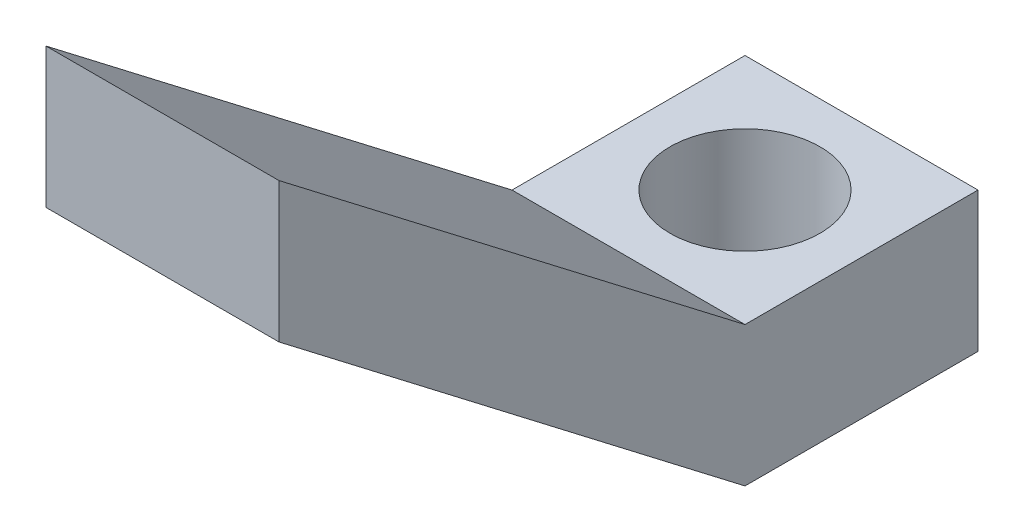
ISO-10303-21;
HEADER;
FILE_DESCRIPTION(('STEP AP214'),'2;1');
FILE_NAME('part.step','',(''),(''),'','','');
FILE_SCHEMA(('AUTOMOTIVE_DESIGN { 1 0 10303 214 1 1 1 1 }'));
ENDSEC;
DATA;
#1=APPLICATION_CONTEXT('core data for automotive mechanical design processes');
#2=APPLICATION_PROTOCOL_DEFINITION('international standard','automotive_design',2000,#1);
#3=PRODUCT_CONTEXT('',#1,'mechanical');
#4=PRODUCT('Part','Part','',(#3));
#5=PRODUCT_RELATED_PRODUCT_CATEGORY('part','',(#4));
#6=PRODUCT_DEFINITION_FORMATION('','',#4);
#7=PRODUCT_DEFINITION_CONTEXT('part definition',#1,'design');
#8=PRODUCT_DEFINITION('design','',#6,#7);
#9=PRODUCT_DEFINITION_SHAPE('','',#8);
#10=(LENGTH_UNIT() NAMED_UNIT(*) SI_UNIT(.MILLI.,.METRE.));
#11=(NAMED_UNIT(*) PLANE_ANGLE_UNIT() SI_UNIT($,.RADIAN.));
#12=(NAMED_UNIT(*) SI_UNIT($,.STERADIAN.) SOLID_ANGLE_UNIT());
#13=UNCERTAINTY_MEASURE_WITH_UNIT(LENGTH_MEASURE(1.E-05),#10,'distance_accuracy_value','');
#14=(GEOMETRIC_REPRESENTATION_CONTEXT(3) GLOBAL_UNCERTAINTY_ASSIGNED_CONTEXT((#13)) GLOBAL_UNIT_ASSIGNED_CONTEXT((#10,
#11,#12)) REPRESENTATION_CONTEXT('',''));
#15=CARTESIAN_POINT('',(0.,0.,0.));
#16=DIRECTION('',(0.,0.,1.));
#17=DIRECTION('',(1.,0.,0.));
#18=AXIS2_PLACEMENT_3D('',#15,#16,#17);
#19=CARTESIAN_POINT('',(12.5,15.,12.5));
#20=DIRECTION('',(-1.,0.,0.));
#21=DIRECTION('',(0.,0.,1.));
#22=AXIS2_PLACEMENT_3D('',#19,#20,#21);
#23=PLANE('',#22);
#24=DIRECTION('',(0.,0.,-1.));
#25=VECTOR('',#24,1.);
#26=CARTESIAN_POINT('',(12.5,0.,12.5));
#27=LINE('',#26,#25);
#28=CARTESIAN_POINT('',(12.5,0.,12.5));
#29=VERTEX_POINT('',#28);
#30=CARTESIAN_POINT('',(12.5,0.,-12.5));
#31=VERTEX_POINT('',#30);
#32=EDGE_CURVE('E82',#29,#31,#27,.T.);
#33=ORIENTED_EDGE('',*,*,#32,.T.);
#34=DIRECTION('',(0.,-1.,0.));
#35=VECTOR('',#34,1.);
#36=CARTESIAN_POINT('',(12.5,15.,-12.5));
#37=LINE('',#36,#35);
#38=CARTESIAN_POINT('',(12.5,15.,-12.5));
#39=VERTEX_POINT('',#38);
#40=EDGE_CURVE('E11',#39,#31,#37,.T.);
#41=ORIENTED_EDGE('',*,*,#40,.F.);
#42=DIRECTION('',(0.,0.,-1.));
#43=VECTOR('',#42,1.);
#44=CARTESIAN_POINT('',(12.5,15.,12.5));
#45=LINE('',#44,#43);
#46=CARTESIAN_POINT('',(12.5,15.,12.5));
#47=VERTEX_POINT('',#46);
#48=EDGE_CURVE('E151',#47,#39,#45,.T.);
#49=ORIENTED_EDGE('',*,*,#48,.F.);
#50=DIRECTION('',(0.,-0.608891231603307,-0.793253722384338));
#51=VECTOR('',#50,1.);
#52=CARTESIAN_POINT('',(12.5,15.,12.5));
#53=LINE('',#52,#51);
#54=CARTESIAN_POINT('',(12.5,53.3793491553446,62.5));
#55=VERTEX_POINT('',#54);
#56=EDGE_CURVE('E117',#55,#47,#53,.T.);
#57=ORIENTED_EDGE('',*,*,#56,.F.);
#58=DIRECTION('',(0.,1.,0.));
#59=VECTOR('',#58,1.);
#60=CARTESIAN_POINT('',(12.5,38.3793491553446,62.5));
#61=LINE('',#60,#59);
#62=CARTESIAN_POINT('',(12.5,38.3793491553446,62.5));
#63=VERTEX_POINT('',#62);
#64=EDGE_CURVE('E107',#63,#55,#61,.T.);
#65=ORIENTED_EDGE('',*,*,#64,.F.);
#66=DIRECTION('',(0.,0.608891231603307,0.793253722384338));
#67=VECTOR('',#66,1.);
#68=CARTESIAN_POINT('',(12.5,0.,12.5));
#69=LINE('',#68,#67);
#70=EDGE_CURVE('E121',#29,#63,#69,.T.);
#71=ORIENTED_EDGE('',*,*,#70,.F.);
#72=EDGE_LOOP('',(#33,#41,#49,#57,#65,#71));
#73=FACE_BOUND('',#72,.T.);
#74=ADVANCED_FACE('F45',(#73),#23,.F.);
#75=CARTESIAN_POINT('',(-12.5,15.,-12.5));
#76=DIRECTION('',(0.,0.,1.));
#77=DIRECTION('',(1.,0.,0.));
#78=AXIS2_PLACEMENT_3D('',#75,#76,#77);
#79=PLANE('',#78);
#80=DIRECTION('',(-1.,0.,0.));
#81=VECTOR('',#80,1.);
#82=CARTESIAN_POINT('',(-12.5,0.,-12.5));
#83=LINE('',#82,#81);
#84=CARTESIAN_POINT('',(-12.5,0.,-12.5));
#85=VERTEX_POINT('',#84);
#86=EDGE_CURVE('E75',#31,#85,#83,.T.);
#87=ORIENTED_EDGE('',*,*,#86,.T.);
#88=DIRECTION('',(0.,-1.,0.));
#89=VECTOR('',#88,1.);
#90=CARTESIAN_POINT('',(-12.5,15.,-12.5));
#91=LINE('',#90,#89);
#92=CARTESIAN_POINT('',(-12.5,15.,-12.5));
#93=VERTEX_POINT('',#92);
#94=EDGE_CURVE('E54',#93,#85,#91,.T.);
#95=ORIENTED_EDGE('',*,*,#94,.F.);
#96=DIRECTION('',(-1.,0.,0.));
#97=VECTOR('',#96,1.);
#98=CARTESIAN_POINT('',(-12.5,15.,-12.5));
#99=LINE('',#98,#97);
#100=EDGE_CURVE('E87',#39,#93,#99,.T.);
#101=ORIENTED_EDGE('',*,*,#100,.F.);
#102=ORIENTED_EDGE('',*,*,#40,.T.);
#103=EDGE_LOOP('',(#87,#95,#101,#102));
#104=FACE_BOUND('',#103,.T.);
#105=ADVANCED_FACE('F177',(#104),#79,.F.);
#106=CARTESIAN_POINT('',(-12.5,15.,12.5));
#107=DIRECTION('',(1.,0.,0.));
#108=DIRECTION('',(0.,0.,-1.));
#109=AXIS2_PLACEMENT_3D('',#106,#107,#108);
#110=PLANE('',#109);
#111=DIRECTION('',(0.,0.,1.));
#112=VECTOR('',#111,1.);
#113=CARTESIAN_POINT('',(-12.5,0.,12.5));
#114=LINE('',#113,#112);
#115=CARTESIAN_POINT('',(-12.5,0.,12.5));
#116=VERTEX_POINT('',#115);
#117=EDGE_CURVE('E165',#85,#116,#114,.T.);
#118=ORIENTED_EDGE('',*,*,#117,.T.);
#119=DIRECTION('',(0.,0.608891231603307,0.793253722384338));
#120=VECTOR('',#119,1.);
#121=CARTESIAN_POINT('',(-12.5,0.,12.5));
#122=LINE('',#121,#120);
#123=CARTESIAN_POINT('',(-12.5,38.3793491553446,62.5));
#124=VERTEX_POINT('',#123);
#125=EDGE_CURVE('E136',#116,#124,#122,.T.);
#126=ORIENTED_EDGE('',*,*,#125,.T.);
#127=DIRECTION('',(0.,1.,0.));
#128=VECTOR('',#127,1.);
#129=CARTESIAN_POINT('',(-12.5,38.3793491553446,62.5));
#130=LINE('',#129,#128);
#131=CARTESIAN_POINT('',(-12.5,53.3793491553446,62.5));
#132=VERTEX_POINT('',#131);
#133=EDGE_CURVE('E110',#124,#132,#130,.T.);
#134=ORIENTED_EDGE('',*,*,#133,.T.);
#135=DIRECTION('',(0.,-0.608891231603307,-0.793253722384338));
#136=VECTOR('',#135,1.);
#137=CARTESIAN_POINT('',(-12.5,15.,12.5));
#138=LINE('',#137,#136);
#139=CARTESIAN_POINT('',(-12.5,15.,12.5));
#140=VERTEX_POINT('',#139);
#141=EDGE_CURVE('E128',#132,#140,#138,.T.);
#142=ORIENTED_EDGE('',*,*,#141,.T.);
#143=DIRECTION('',(0.,0.,1.));
#144=VECTOR('',#143,1.);
#145=CARTESIAN_POINT('',(-12.5,15.,12.5));
#146=LINE('',#145,#144);
#147=EDGE_CURVE('E156',#93,#140,#146,.T.);
#148=ORIENTED_EDGE('',*,*,#147,.F.);
#149=ORIENTED_EDGE('',*,*,#94,.T.);
#150=EDGE_LOOP('',(#118,#126,#134,#142,#148,#149));
#151=FACE_BOUND('',#150,.T.);
#152=ADVANCED_FACE('F174',(#151),#110,.F.);
#153=CARTESIAN_POINT('',(0.,15.,0.));
#154=DIRECTION('',(0.,-1.,0.));
#155=DIRECTION('',(0.,0.,-1.));
#156=AXIS2_PLACEMENT_3D('',#153,#154,#155);
#157=PLANE('',#156);
#158=CARTESIAN_POINT('',(0.,15.,0.));
#159=DIRECTION('',(0.,1.,0.));
#160=DIRECTION('',(0.,0.,1.));
#161=AXIS2_PLACEMENT_3D('',#158,#159,#160);
#162=CIRCLE('',#161,8.05);
#163=CARTESIAN_POINT('',(0.,15.,8.05));
#164=VERTEX_POINT('',#163);
#165=EDGE_CURVE('E142',#164,#164,#162,.T.);
#166=ORIENTED_EDGE('',*,*,#165,.F.);
#167=EDGE_LOOP('',(#166));
#168=FACE_BOUND('',#167,.T.);
#169=ORIENTED_EDGE('',*,*,#48,.T.);
#170=ORIENTED_EDGE('',*,*,#100,.T.);
#171=ORIENTED_EDGE('',*,*,#147,.T.);
#172=DIRECTION('',(1.,0.,0.));
#173=VECTOR('',#172,1.);
#174=CARTESIAN_POINT('',(-12.5,15.,12.5));
#175=LINE('',#174,#173);
#176=EDGE_CURVE('E62',#140,#47,#175,.T.);
#177=ORIENTED_EDGE('',*,*,#176,.T.);
#178=EDGE_LOOP('',(#169,#170,#171,#177));
#179=FACE_BOUND('',#178,.T.);
#180=ADVANCED_FACE('F199',(#168,#179),#157,.F.);
#181=CARTESIAN_POINT('',(0.,0.,0.));
#182=DIRECTION('',(0.,-1.,0.));
#183=DIRECTION('',(0.,0.,-1.));
#184=AXIS2_PLACEMENT_3D('',#181,#182,#183);
#185=PLANE('',#184);
#186=CARTESIAN_POINT('',(0.,0.,0.));
#187=DIRECTION('',(0.,1.,0.));
#188=DIRECTION('',(0.,0.,1.));
#189=AXIS2_PLACEMENT_3D('',#186,#187,#188);
#190=CIRCLE('',#189,8.05);
#191=CARTESIAN_POINT('',(0.,0.,8.05));
#192=VERTEX_POINT('',#191);
#193=EDGE_CURVE('E144',#192,#192,#190,.T.);
#194=ORIENTED_EDGE('',*,*,#193,.T.);
#195=EDGE_LOOP('',(#194));
#196=FACE_BOUND('',#195,.T.);
#197=ORIENTED_EDGE('',*,*,#32,.F.);
#198=DIRECTION('',(1.,0.,0.));
#199=VECTOR('',#198,1.);
#200=CARTESIAN_POINT('',(-12.5,0.,12.5));
#201=LINE('',#200,#199);
#202=EDGE_CURVE('E126',#116,#29,#201,.T.);
#203=ORIENTED_EDGE('',*,*,#202,.F.);
#204=ORIENTED_EDGE('',*,*,#117,.F.);
#205=ORIENTED_EDGE('',*,*,#86,.F.);
#206=EDGE_LOOP('',(#197,#203,#204,#205));
#207=FACE_BOUND('',#206,.T.);
#208=ADVANCED_FACE('F175',(#196,#207),#185,.T.);
#209=CARTESIAN_POINT('',(0.,0.,0.));
#210=DIRECTION('',(0.,1.,0.));
#211=DIRECTION('',(0.,0.,1.));
#212=AXIS2_PLACEMENT_3D('',#209,#210,#211);
#213=CYLINDRICAL_SURFACE('',#212,8.05);
#214=ORIENTED_EDGE('',*,*,#193,.F.);
#215=EDGE_LOOP('',(#214));
#216=FACE_BOUND('',#215,.T.);
#217=ORIENTED_EDGE('',*,*,#165,.T.);
#218=EDGE_LOOP('',(#217));
#219=FACE_BOUND('',#218,.T.);
#220=ADVANCED_FACE('F182',(#216,#219),#213,.F.);
#221=CARTESIAN_POINT('',(12.5,15.,12.5));
#222=DIRECTION('',(0.,0.793253722384338,-0.608891231603307));
#223=DIRECTION('',(0.,0.608891231603307,0.793253722384338));
#224=AXIS2_PLACEMENT_3D('',#221,#222,#223);
#225=PLANE('',#224);
#226=ORIENTED_EDGE('',*,*,#141,.F.);
#227=DIRECTION('',(-1.,0.,0.));
#228=VECTOR('',#227,1.);
#229=CARTESIAN_POINT('',(12.5,53.3793491553446,62.5));
#230=LINE('',#229,#228);
#231=EDGE_CURVE('E116',#55,#132,#230,.T.);
#232=ORIENTED_EDGE('',*,*,#231,.F.);
#233=ORIENTED_EDGE('',*,*,#56,.T.);
#234=ORIENTED_EDGE('',*,*,#176,.F.);
#235=EDGE_LOOP('',(#226,#232,#233,#234));
#236=FACE_BOUND('',#235,.T.);
#237=ADVANCED_FACE('F180',(#236),#225,.T.);
#238=CARTESIAN_POINT('',(12.5,38.3793491553446,62.5));
#239=DIRECTION('',(0.,0.,1.));
#240=DIRECTION('',(1.,0.,0.));
#241=AXIS2_PLACEMENT_3D('',#238,#239,#240);
#242=PLANE('',#241);
#243=ORIENTED_EDGE('',*,*,#133,.F.);
#244=DIRECTION('',(-1.,0.,0.));
#245=VECTOR('',#244,1.);
#246=CARTESIAN_POINT('',(12.5,38.3793491553446,62.5));
#247=LINE('',#246,#245);
#248=EDGE_CURVE('E104',#63,#124,#247,.T.);
#249=ORIENTED_EDGE('',*,*,#248,.F.);
#250=ORIENTED_EDGE('',*,*,#64,.T.);
#251=ORIENTED_EDGE('',*,*,#231,.T.);
#252=EDGE_LOOP('',(#243,#249,#250,#251));
#253=FACE_BOUND('',#252,.T.);
#254=ADVANCED_FACE('F106',(#253),#242,.T.);
#255=CARTESIAN_POINT('',(12.5,0.,12.5));
#256=DIRECTION('',(0.,-0.793253722384338,0.608891231603307));
#257=DIRECTION('',(0.,-0.608891231603307,-0.793253722384338));
#258=AXIS2_PLACEMENT_3D('',#255,#256,#257);
#259=PLANE('',#258);
#260=ORIENTED_EDGE('',*,*,#125,.F.);
#261=ORIENTED_EDGE('',*,*,#202,.T.);
#262=ORIENTED_EDGE('',*,*,#70,.T.);
#263=ORIENTED_EDGE('',*,*,#248,.T.);
#264=EDGE_LOOP('',(#260,#261,#262,#263));
#265=FACE_BOUND('',#264,.T.);
#266=ADVANCED_FACE('F125',(#265),#259,.T.);
#267=CLOSED_SHELL('',(#74,#105,#152,#180,#208,#220,#237,#254,#266));
#268=MANIFOLD_SOLID_BREP('B2',#267);
#269=ADVANCED_BREP_SHAPE_REPRESENTATION('',(#18,#268),#14);
#270=SHAPE_DEFINITION_REPRESENTATION(#9,#269);
ENDSEC;
END-ISO-10303-21;
